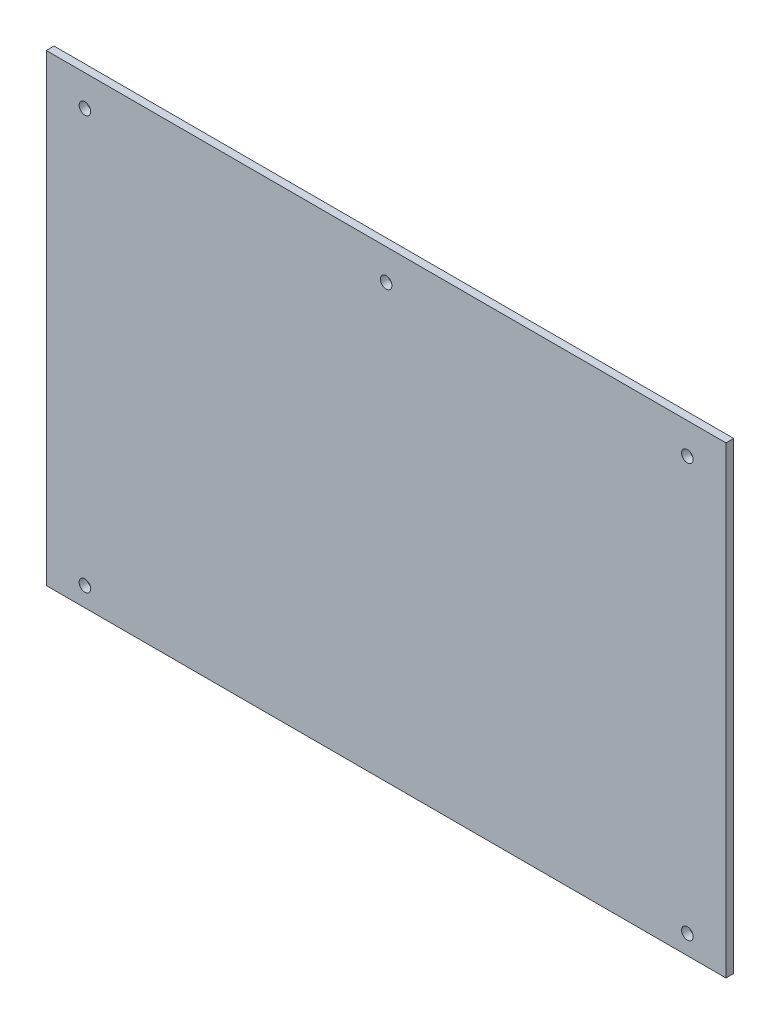
ISO-10303-21;
HEADER;
FILE_DESCRIPTION(('STEP AP214'),'2;1');
FILE_NAME('part.step','',(''),(''),'','','');
FILE_SCHEMA(('AUTOMOTIVE_DESIGN { 1 0 10303 214 1 1 1 1 }'));
ENDSEC;
DATA;
#1=APPLICATION_CONTEXT('core data for automotive mechanical design processes');
#2=APPLICATION_PROTOCOL_DEFINITION('international standard','automotive_design',2000,#1);
#3=PRODUCT_CONTEXT('',#1,'mechanical');
#4=PRODUCT('Part','Part','',(#3));
#5=PRODUCT_RELATED_PRODUCT_CATEGORY('part','',(#4));
#6=PRODUCT_DEFINITION_FORMATION('','',#4);
#7=PRODUCT_DEFINITION_CONTEXT('part definition',#1,'design');
#8=PRODUCT_DEFINITION('design','',#6,#7);
#9=PRODUCT_DEFINITION_SHAPE('','',#8);
#10=(LENGTH_UNIT() NAMED_UNIT(*) SI_UNIT(.MILLI.,.METRE.));
#11=(NAMED_UNIT(*) PLANE_ANGLE_UNIT() SI_UNIT($,.RADIAN.));
#12=(NAMED_UNIT(*) SI_UNIT($,.STERADIAN.) SOLID_ANGLE_UNIT());
#13=UNCERTAINTY_MEASURE_WITH_UNIT(LENGTH_MEASURE(1.E-05),#10,'distance_accuracy_value','');
#14=(GEOMETRIC_REPRESENTATION_CONTEXT(3) GLOBAL_UNCERTAINTY_ASSIGNED_CONTEXT((#13)) GLOBAL_UNIT_ASSIGNED_CONTEXT((#10,
#11,#12)) REPRESENTATION_CONTEXT('',''));
#15=CARTESIAN_POINT('',(0.,0.,0.));
#16=DIRECTION('',(0.,0.,1.));
#17=DIRECTION('',(1.,0.,0.));
#18=AXIS2_PLACEMENT_3D('',#15,#16,#17);
#19=CARTESIAN_POINT('',(0.,0.,6.35));
#20=DIRECTION('',(0.,0.,1.));
#21=DIRECTION('',(1.,0.,0.));
#22=AXIS2_PLACEMENT_3D('',#19,#20,#21);
#23=PLANE('',#22);
#24=CARTESIAN_POINT('',(527.05,15.875,6.35));
#25=DIRECTION('',(0.,0.,1.));
#26=DIRECTION('',(1.,0.,0.));
#27=AXIS2_PLACEMENT_3D('',#24,#25,#26);
#28=CIRCLE('',#27,4.7625);
#29=CARTESIAN_POINT('',(531.8125,15.875,6.35));
#30=VERTEX_POINT('',#29);
#31=EDGE_CURVE('E94',#30,#30,#28,.F.);
#32=ORIENTED_EDGE('',*,*,#31,.T.);
#33=EDGE_LOOP('',(#32));
#34=FACE_BOUND('',#33,.T.);
#35=CARTESIAN_POINT('',(527.05,355.6,6.35));
#36=DIRECTION('',(0.,0.,1.));
#37=DIRECTION('',(1.,0.,0.));
#38=AXIS2_PLACEMENT_3D('',#35,#36,#37);
#39=CIRCLE('',#38,4.7625);
#40=CARTESIAN_POINT('',(531.8125,355.6,6.35));
#41=VERTEX_POINT('',#40);
#42=EDGE_CURVE('E97',#41,#41,#39,.F.);
#43=ORIENTED_EDGE('',*,*,#42,.T.);
#44=EDGE_LOOP('',(#43));
#45=FACE_BOUND('',#44,.T.);
#46=CARTESIAN_POINT('',(279.4,355.6,6.35));
#47=DIRECTION('',(0.,0.,1.));
#48=DIRECTION('',(1.,0.,0.));
#49=AXIS2_PLACEMENT_3D('',#46,#47,#48);
#50=CIRCLE('',#49,4.7625);
#51=CARTESIAN_POINT('',(284.1625,355.6,6.35));
#52=VERTEX_POINT('',#51);
#53=EDGE_CURVE('E100',#52,#52,#50,.F.);
#54=ORIENTED_EDGE('',*,*,#53,.T.);
#55=EDGE_LOOP('',(#54));
#56=FACE_BOUND('',#55,.T.);
#57=CARTESIAN_POINT('',(31.75,355.6,6.35));
#58=DIRECTION('',(0.,0.,1.));
#59=DIRECTION('',(1.,0.,0.));
#60=AXIS2_PLACEMENT_3D('',#57,#58,#59);
#61=CIRCLE('',#60,4.7625);
#62=CARTESIAN_POINT('',(36.5125,355.6,6.35));
#63=VERTEX_POINT('',#62);
#64=EDGE_CURVE('E102',#63,#63,#61,.F.);
#65=ORIENTED_EDGE('',*,*,#64,.T.);
#66=EDGE_LOOP('',(#65));
#67=FACE_BOUND('',#66,.T.);
#68=CARTESIAN_POINT('',(31.75,15.875,6.35));
#69=DIRECTION('',(0.,0.,1.));
#70=DIRECTION('',(1.,0.,0.));
#71=AXIS2_PLACEMENT_3D('',#68,#69,#70);
#72=CIRCLE('',#71,4.7625);
#73=CARTESIAN_POINT('',(36.5125,15.875,6.35));
#74=VERTEX_POINT('',#73);
#75=EDGE_CURVE('E19',#74,#74,#72,.F.);
#76=ORIENTED_EDGE('',*,*,#75,.T.);
#77=EDGE_LOOP('',(#76));
#78=FACE_BOUND('',#77,.T.);
#79=DIRECTION('',(0.,1.,0.));
#80=VECTOR('',#79,1.);
#81=CARTESIAN_POINT('',(0.,381.,6.35));
#82=LINE('',#81,#80);
#83=CARTESIAN_POINT('',(0.,0.,6.35));
#84=VERTEX_POINT('',#83);
#85=CARTESIAN_POINT('',(0.,381.,6.35));
#86=VERTEX_POINT('',#85);
#87=EDGE_CURVE('E70',#84,#86,#82,.T.);
#88=ORIENTED_EDGE('',*,*,#87,.F.);
#89=DIRECTION('',(1.,0.,0.));
#90=VECTOR('',#89,1.);
#91=CARTESIAN_POINT('',(0.,0.,6.35));
#92=LINE('',#91,#90);
#93=CARTESIAN_POINT('',(558.8,0.,6.35));
#94=VERTEX_POINT('',#93);
#95=EDGE_CURVE('E67',#94,#84,#92,.F.);
#96=ORIENTED_EDGE('',*,*,#95,.F.);
#97=DIRECTION('',(0.,1.,0.));
#98=VECTOR('',#97,1.);
#99=CARTESIAN_POINT('',(558.8,0.,6.35));
#100=LINE('',#99,#98);
#101=CARTESIAN_POINT('',(558.8,381.,6.35));
#102=VERTEX_POINT('',#101);
#103=EDGE_CURVE('E58',#102,#94,#100,.F.);
#104=ORIENTED_EDGE('',*,*,#103,.F.);
#105=DIRECTION('',(1.,0.,0.));
#106=VECTOR('',#105,1.);
#107=CARTESIAN_POINT('',(558.8,381.,6.35));
#108=LINE('',#107,#106);
#109=EDGE_CURVE('E53',#86,#102,#108,.T.);
#110=ORIENTED_EDGE('',*,*,#109,.F.);
#111=EDGE_LOOP('',(#88,#96,#104,#110));
#112=FACE_BOUND('',#111,.T.);
#113=ADVANCED_FACE('F16',(#34,#45,#56,#67,#78,#112),#23,.T.);
#114=CARTESIAN_POINT('',(0.,0.,0.));
#115=DIRECTION('',(0.,-1.,0.));
#116=DIRECTION('',(0.,0.,-1.));
#117=AXIS2_PLACEMENT_3D('',#114,#115,#116);
#118=PLANE('',#117);
#119=DIRECTION('',(0.,0.,1.));
#120=VECTOR('',#119,1.);
#121=CARTESIAN_POINT('',(0.,0.,0.));
#122=LINE('',#121,#120);
#123=CARTESIAN_POINT('',(0.,0.,0.));
#124=VERTEX_POINT('',#123);
#125=EDGE_CURVE('E110',#124,#84,#122,.T.);
#126=ORIENTED_EDGE('',*,*,#125,.F.);
#127=DIRECTION('',(1.,0.,0.));
#128=VECTOR('',#127,1.);
#129=CARTESIAN_POINT('',(0.,0.,0.));
#130=LINE('',#129,#128);
#131=CARTESIAN_POINT('',(558.8,0.,0.));
#132=VERTEX_POINT('',#131);
#133=EDGE_CURVE('E77',#124,#132,#130,.T.);
#134=ORIENTED_EDGE('',*,*,#133,.T.);
#135=DIRECTION('',(0.,0.,-1.));
#136=VECTOR('',#135,1.);
#137=CARTESIAN_POINT('',(558.8,0.,0.));
#138=LINE('',#137,#136);
#139=EDGE_CURVE('E63',#94,#132,#138,.T.);
#140=ORIENTED_EDGE('',*,*,#139,.F.);
#141=ORIENTED_EDGE('',*,*,#95,.T.);
#142=EDGE_LOOP('',(#126,#134,#140,#141));
#143=FACE_BOUND('',#142,.T.);
#144=ADVANCED_FACE('F76',(#143),#118,.T.);
#145=CARTESIAN_POINT('',(558.8,0.,0.));
#146=DIRECTION('',(1.,0.,0.));
#147=DIRECTION('',(0.,0.,-1.));
#148=AXIS2_PLACEMENT_3D('',#145,#146,#147);
#149=PLANE('',#148);
#150=ORIENTED_EDGE('',*,*,#139,.T.);
#151=DIRECTION('',(0.,1.,0.));
#152=VECTOR('',#151,1.);
#153=CARTESIAN_POINT('',(558.8,0.,0.));
#154=LINE('',#153,#152);
#155=CARTESIAN_POINT('',(558.8,381.,0.));
#156=VERTEX_POINT('',#155);
#157=EDGE_CURVE('E121',#132,#156,#154,.T.);
#158=ORIENTED_EDGE('',*,*,#157,.T.);
#159=DIRECTION('',(0.,0.,1.));
#160=VECTOR('',#159,1.);
#161=CARTESIAN_POINT('',(558.8,381.,0.));
#162=LINE('',#161,#160);
#163=EDGE_CURVE('E65',#102,#156,#162,.F.);
#164=ORIENTED_EDGE('',*,*,#163,.F.);
#165=ORIENTED_EDGE('',*,*,#103,.T.);
#166=EDGE_LOOP('',(#150,#158,#164,#165));
#167=FACE_BOUND('',#166,.T.);
#168=ADVANCED_FACE('F60',(#167),#149,.T.);
#169=CARTESIAN_POINT('',(558.8,381.,0.));
#170=DIRECTION('',(0.,1.,0.));
#171=DIRECTION('',(0.,0.,1.));
#172=AXIS2_PLACEMENT_3D('',#169,#170,#171);
#173=PLANE('',#172);
#174=ORIENTED_EDGE('',*,*,#163,.T.);
#175=DIRECTION('',(1.,0.,0.));
#176=VECTOR('',#175,1.);
#177=CARTESIAN_POINT('',(0.,381.,0.));
#178=LINE('',#177,#176);
#179=CARTESIAN_POINT('',(0.,381.,0.));
#180=VERTEX_POINT('',#179);
#181=EDGE_CURVE('E118',#156,#180,#178,.F.);
#182=ORIENTED_EDGE('',*,*,#181,.T.);
#183=DIRECTION('',(0.,0.,1.));
#184=VECTOR('',#183,1.);
#185=CARTESIAN_POINT('',(0.,381.,0.));
#186=LINE('',#185,#184);
#187=EDGE_CURVE('E34',#86,#180,#186,.F.);
#188=ORIENTED_EDGE('',*,*,#187,.F.);
#189=ORIENTED_EDGE('',*,*,#109,.T.);
#190=EDGE_LOOP('',(#174,#182,#188,#189));
#191=FACE_BOUND('',#190,.T.);
#192=ADVANCED_FACE('F117',(#191),#173,.T.);
#193=CARTESIAN_POINT('',(0.,381.,0.));
#194=DIRECTION('',(-1.,0.,0.));
#195=DIRECTION('',(0.,0.,1.));
#196=AXIS2_PLACEMENT_3D('',#193,#194,#195);
#197=PLANE('',#196);
#198=ORIENTED_EDGE('',*,*,#187,.T.);
#199=DIRECTION('',(0.,1.,0.));
#200=VECTOR('',#199,1.);
#201=CARTESIAN_POINT('',(0.,0.,0.));
#202=LINE('',#201,#200);
#203=EDGE_CURVE('E93',#180,#124,#202,.F.);
#204=ORIENTED_EDGE('',*,*,#203,.T.);
#205=ORIENTED_EDGE('',*,*,#125,.T.);
#206=ORIENTED_EDGE('',*,*,#87,.T.);
#207=EDGE_LOOP('',(#198,#204,#205,#206));
#208=FACE_BOUND('',#207,.T.);
#209=ADVANCED_FACE('F124',(#208),#197,.T.);
#210=CARTESIAN_POINT('',(31.75,15.875,6.35));
#211=DIRECTION('',(0.,0.,1.));
#212=DIRECTION('',(1.,0.,0.));
#213=AXIS2_PLACEMENT_3D('',#210,#211,#212);
#214=CYLINDRICAL_SURFACE('',#213,4.7625);
#215=ORIENTED_EDGE('',*,*,#75,.F.);
#216=EDGE_LOOP('',(#215));
#217=FACE_BOUND('',#216,.T.);
#218=CARTESIAN_POINT('',(31.75,15.875,0.));
#219=DIRECTION('',(0.,0.,1.));
#220=DIRECTION('',(1.,0.,0.));
#221=AXIS2_PLACEMENT_3D('',#218,#219,#220);
#222=CIRCLE('',#221,4.7625);
#223=CARTESIAN_POINT('',(36.5125,15.875,0.));
#224=VERTEX_POINT('',#223);
#225=EDGE_CURVE('E90',#224,#224,#222,.F.);
#226=ORIENTED_EDGE('',*,*,#225,.T.);
#227=EDGE_LOOP('',(#226));
#228=FACE_BOUND('',#227,.T.);
#229=ADVANCED_FACE('F126',(#217,#228),#214,.F.);
#230=CARTESIAN_POINT('',(31.75,355.6,6.35));
#231=DIRECTION('',(0.,0.,1.));
#232=DIRECTION('',(1.,0.,0.));
#233=AXIS2_PLACEMENT_3D('',#230,#231,#232);
#234=CYLINDRICAL_SURFACE('',#233,4.7625);
#235=ORIENTED_EDGE('',*,*,#64,.F.);
#236=EDGE_LOOP('',(#235));
#237=FACE_BOUND('',#236,.T.);
#238=CARTESIAN_POINT('',(31.75,355.6,0.));
#239=DIRECTION('',(0.,0.,1.));
#240=DIRECTION('',(1.,0.,0.));
#241=AXIS2_PLACEMENT_3D('',#238,#239,#240);
#242=CIRCLE('',#241,4.7625);
#243=CARTESIAN_POINT('',(36.5125,355.6,0.));
#244=VERTEX_POINT('',#243);
#245=EDGE_CURVE('E87',#244,#244,#242,.F.);
#246=ORIENTED_EDGE('',*,*,#245,.T.);
#247=EDGE_LOOP('',(#246));
#248=FACE_BOUND('',#247,.T.);
#249=ADVANCED_FACE('F133',(#237,#248),#234,.F.);
#250=CARTESIAN_POINT('',(279.4,355.6,6.35));
#251=DIRECTION('',(0.,0.,1.));
#252=DIRECTION('',(1.,0.,0.));
#253=AXIS2_PLACEMENT_3D('',#250,#251,#252);
#254=CYLINDRICAL_SURFACE('',#253,4.7625);
#255=ORIENTED_EDGE('',*,*,#53,.F.);
#256=EDGE_LOOP('',(#255));
#257=FACE_BOUND('',#256,.T.);
#258=CARTESIAN_POINT('',(279.4,355.6,0.));
#259=DIRECTION('',(0.,0.,1.));
#260=DIRECTION('',(1.,0.,0.));
#261=AXIS2_PLACEMENT_3D('',#258,#259,#260);
#262=CIRCLE('',#261,4.7625);
#263=CARTESIAN_POINT('',(284.1625,355.6,0.));
#264=VERTEX_POINT('',#263);
#265=EDGE_CURVE('E84',#264,#264,#262,.F.);
#266=ORIENTED_EDGE('',*,*,#265,.T.);
#267=EDGE_LOOP('',(#266));
#268=FACE_BOUND('',#267,.T.);
#269=ADVANCED_FACE('F152',(#257,#268),#254,.F.);
#270=CARTESIAN_POINT('',(527.05,355.6,6.35));
#271=DIRECTION('',(0.,0.,1.));
#272=DIRECTION('',(1.,0.,0.));
#273=AXIS2_PLACEMENT_3D('',#270,#271,#272);
#274=CYLINDRICAL_SURFACE('',#273,4.7625);
#275=ORIENTED_EDGE('',*,*,#42,.F.);
#276=EDGE_LOOP('',(#275));
#277=FACE_BOUND('',#276,.T.);
#278=CARTESIAN_POINT('',(527.05,355.6,0.));
#279=DIRECTION('',(0.,0.,1.));
#280=DIRECTION('',(1.,0.,0.));
#281=AXIS2_PLACEMENT_3D('',#278,#279,#280);
#282=CIRCLE('',#281,4.7625);
#283=CARTESIAN_POINT('',(531.8125,355.6,0.));
#284=VERTEX_POINT('',#283);
#285=EDGE_CURVE('E25',#284,#284,#282,.F.);
#286=ORIENTED_EDGE('',*,*,#285,.T.);
#287=EDGE_LOOP('',(#286));
#288=FACE_BOUND('',#287,.T.);
#289=ADVANCED_FACE('F144',(#277,#288),#274,.F.);
#290=CARTESIAN_POINT('',(527.05,15.875,6.35));
#291=DIRECTION('',(0.,0.,1.));
#292=DIRECTION('',(1.,0.,0.));
#293=AXIS2_PLACEMENT_3D('',#290,#291,#292);
#294=CYLINDRICAL_SURFACE('',#293,4.7625);
#295=ORIENTED_EDGE('',*,*,#31,.F.);
#296=EDGE_LOOP('',(#295));
#297=FACE_BOUND('',#296,.T.);
#298=CARTESIAN_POINT('',(527.05,15.875,0.));
#299=DIRECTION('',(0.,0.,1.));
#300=DIRECTION('',(1.,0.,0.));
#301=AXIS2_PLACEMENT_3D('',#298,#299,#300);
#302=CIRCLE('',#301,4.7625);
#303=CARTESIAN_POINT('',(531.8125,15.875,0.));
#304=VERTEX_POINT('',#303);
#305=EDGE_CURVE('E11',#304,#304,#302,.F.);
#306=ORIENTED_EDGE('',*,*,#305,.T.);
#307=EDGE_LOOP('',(#306));
#308=FACE_BOUND('',#307,.T.);
#309=ADVANCED_FACE('F138',(#297,#308),#294,.F.);
#310=CARTESIAN_POINT('',(0.,0.,0.));
#311=DIRECTION('',(0.,0.,1.));
#312=DIRECTION('',(1.,0.,0.));
#313=AXIS2_PLACEMENT_3D('',#310,#311,#312);
#314=PLANE('',#313);
#315=ORIENTED_EDGE('',*,*,#305,.F.);
#316=EDGE_LOOP('',(#315));
#317=FACE_BOUND('',#316,.T.);
#318=ORIENTED_EDGE('',*,*,#285,.F.);
#319=EDGE_LOOP('',(#318));
#320=FACE_BOUND('',#319,.T.);
#321=ORIENTED_EDGE('',*,*,#265,.F.);
#322=EDGE_LOOP('',(#321));
#323=FACE_BOUND('',#322,.T.);
#324=ORIENTED_EDGE('',*,*,#245,.F.);
#325=EDGE_LOOP('',(#324));
#326=FACE_BOUND('',#325,.T.);
#327=ORIENTED_EDGE('',*,*,#225,.F.);
#328=EDGE_LOOP('',(#327));
#329=FACE_BOUND('',#328,.T.);
#330=ORIENTED_EDGE('',*,*,#181,.F.);
#331=ORIENTED_EDGE('',*,*,#157,.F.);
#332=ORIENTED_EDGE('',*,*,#133,.F.);
#333=ORIENTED_EDGE('',*,*,#203,.F.);
#334=EDGE_LOOP('',(#330,#331,#332,#333));
#335=FACE_BOUND('',#334,.T.);
#336=ADVANCED_FACE('F120',(#317,#320,#323,#326,#329,#335),#314,.F.);
#337=CLOSED_SHELL('',(#113,#144,#168,#192,#209,#229,#249,#269,#289,#309,#336));
#338=MANIFOLD_SOLID_BREP('B1',#337);
#339=ADVANCED_BREP_SHAPE_REPRESENTATION('',(#18,#338),#14);
#340=SHAPE_DEFINITION_REPRESENTATION(#9,#339);
ENDSEC;
END-ISO-10303-21;
